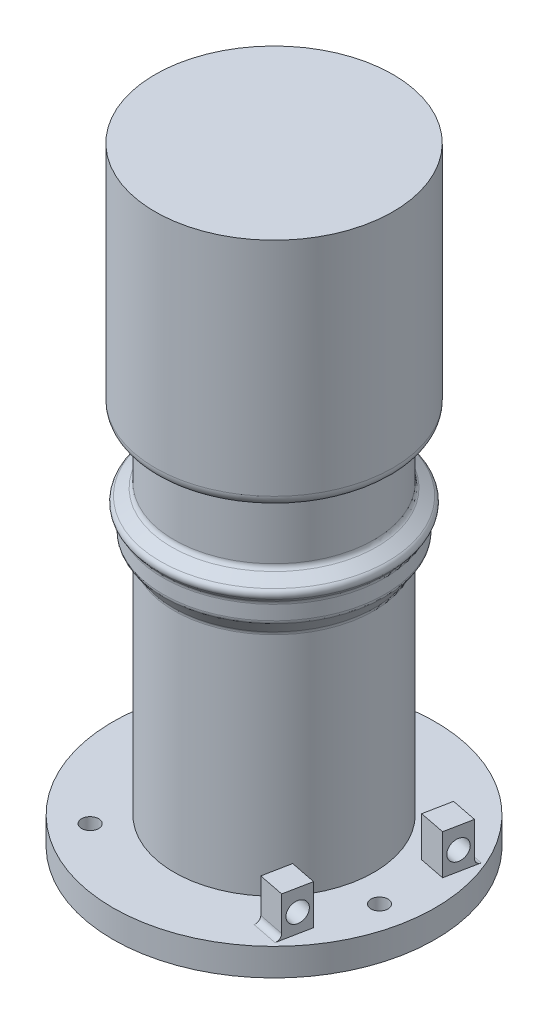
ISO-10303-21;
HEADER;
FILE_DESCRIPTION(('STEP AP214'),'2;1');
FILE_NAME('part.step','',(''),(''),'','','');
FILE_SCHEMA(('AUTOMOTIVE_DESIGN { 1 0 10303 214 1 1 1 1 }'));
ENDSEC;
DATA;
#1=APPLICATION_CONTEXT('core data for automotive mechanical design processes');
#2=APPLICATION_PROTOCOL_DEFINITION('international standard','automotive_design',2000,#1);
#3=PRODUCT_CONTEXT('',#1,'mechanical');
#4=PRODUCT('Part','Part','',(#3));
#5=PRODUCT_RELATED_PRODUCT_CATEGORY('part','',(#4));
#6=PRODUCT_DEFINITION_FORMATION('','',#4);
#7=PRODUCT_DEFINITION_CONTEXT('part definition',#1,'design');
#8=PRODUCT_DEFINITION('design','',#6,#7);
#9=PRODUCT_DEFINITION_SHAPE('','',#8);
#10=(LENGTH_UNIT() NAMED_UNIT(*) SI_UNIT(.MILLI.,.METRE.));
#11=(NAMED_UNIT(*) PLANE_ANGLE_UNIT() SI_UNIT($,.RADIAN.));
#12=(NAMED_UNIT(*) SI_UNIT($,.STERADIAN.) SOLID_ANGLE_UNIT());
#13=UNCERTAINTY_MEASURE_WITH_UNIT(LENGTH_MEASURE(1.E-05),#10,'distance_accuracy_value','');
#14=(GEOMETRIC_REPRESENTATION_CONTEXT(3) GLOBAL_UNCERTAINTY_ASSIGNED_CONTEXT((#13)) GLOBAL_UNIT_ASSIGNED_CONTEXT((#10,
#11,#12)) REPRESENTATION_CONTEXT('',''));
#15=CARTESIAN_POINT('',(0.,0.,0.));
#16=DIRECTION('',(0.,0.,1.));
#17=DIRECTION('',(1.,0.,0.));
#18=AXIS2_PLACEMENT_3D('',#15,#16,#17);
#19=CARTESIAN_POINT('',(0.,0.,0.));
#20=DIRECTION('',(0.,-1.,0.));
#21=DIRECTION('',(0.,0.,-1.));
#22=AXIS2_PLACEMENT_3D('',#19,#20,#21);
#23=PLANE('',#22);
#24=DIRECTION('',(-0.193989978070431,0.,0.981003510905152));
#25=VECTOR('',#24,1.);
#26=CARTESIAN_POINT('',(52.5606892906882,0.,-27.3563771241391));
#27=LINE('',#26,#25);
#28=CARTESIAN_POINT('',(53.0534238349871,0.,-29.8481260418382));
#29=VERTEX_POINT('',#28);
#30=CARTESIAN_POINT('',(50.2164876364986,0.,-15.5017953776802));
#31=VERTEX_POINT('',#30);
#32=EDGE_CURVE('E59',#29,#31,#27,.T.);
#33=ORIENTED_EDGE('',*,*,#32,.F.);
#34=DIRECTION('',(-0.981003510905151,0.,-0.193989978070432));
#35=VECTOR('',#34,1.);
#36=CARTESIAN_POINT('',(64.6544074646223,0.,-27.5540725192041));
#37=LINE('',#36,#35);
#38=CARTESIAN_POINT('',(64.6544074646223,0.,-27.5540725192041));
#39=VERTEX_POINT('',#38);
#40=EDGE_CURVE('E223',#29,#39,#37,.F.);
#41=ORIENTED_EDGE('',*,*,#40,.T.);
#42=DIRECTION('',(0.193989978070431,0.,-0.981003510905151));
#43=VECTOR('',#42,1.);
#44=CARTESIAN_POINT('',(64.1616729203234,0.,-25.062323601505));
#45=LINE('',#44,#43);
#46=CARTESIAN_POINT('',(61.8174712661338,0.,-13.2077418550461));
#47=VERTEX_POINT('',#46);
#48=EDGE_CURVE('E67',#47,#39,#45,.T.);
#49=ORIENTED_EDGE('',*,*,#48,.F.);
#50=DIRECTION('',(0.981003510905151,0.,0.193989978070431));
#51=VECTOR('',#50,1.);
#52=CARTESIAN_POINT('',(50.2164876364986,0.,-15.5017953776802));
#53=LINE('',#52,#51);
#54=EDGE_CURVE('E148',#31,#47,#53,.T.);
#55=ORIENTED_EDGE('',*,*,#54,.F.);
#56=EDGE_LOOP('',(#33,#41,#49,#55));
#57=FACE_BOUND('',#56,.T.);
#58=CARTESIAN_POINT('',(57.8789311065348,0.,10.9245812682706));
#59=DIRECTION('',(0.,-1.,0.));
#60=DIRECTION('',(0.,0.,-1.));
#61=AXIS2_PLACEMENT_3D('',#58,#59,#60);
#62=CIRCLE('',#61,3.81);
#63=CARTESIAN_POINT('',(57.8789311065348,0.,7.11458126827061));
#64=VERTEX_POINT('',#63);
#65=EDGE_CURVE('E181',#64,#64,#62,.F.);
#66=ORIENTED_EDGE('',*,*,#65,.F.);
#67=EDGE_LOOP('',(#66));
#68=FACE_BOUND('',#67,.T.);
#69=CARTESIAN_POINT('',(-18.7753126158593,0.,-54.9823180924778));
#70=DIRECTION('',(0.,-1.,0.));
#71=DIRECTION('',(0.,0.,-1.));
#72=AXIS2_PLACEMENT_3D('',#69,#70,#71);
#73=CIRCLE('',#72,3.81);
#74=CARTESIAN_POINT('',(-18.7753126158593,0.,-58.7923180924778));
#75=VERTEX_POINT('',#74);
#76=EDGE_CURVE('E182',#75,#75,#73,.F.);
#77=ORIENTED_EDGE('',*,*,#76,.F.);
#78=EDGE_LOOP('',(#77));
#79=FACE_BOUND('',#78,.T.);
#80=CARTESIAN_POINT('',(-37.5252398857347,0.,44.3556539593735));
#81=DIRECTION('',(0.,-1.,0.));
#82=DIRECTION('',(0.,0.,-1.));
#83=AXIS2_PLACEMENT_3D('',#80,#81,#82);
#84=CIRCLE('',#83,3.81);
#85=CARTESIAN_POINT('',(-37.5252398857347,0.,40.5456539593735));
#86=VERTEX_POINT('',#85);
#87=EDGE_CURVE('E192',#86,#86,#84,.F.);
#88=ORIENTED_EDGE('',*,*,#87,.F.);
#89=EDGE_LOOP('',(#88));
#90=FACE_BOUND('',#89,.T.);
#91=CARTESIAN_POINT('',(0.,0.,0.));
#92=DIRECTION('',(0.,-1.,0.));
#93=DIRECTION('',(0.,0.,-1.));
#94=AXIS2_PLACEMENT_3D('',#91,#92,#93);
#95=CIRCLE('',#94,44.45);
#96=CARTESIAN_POINT('',(0.,0.,-44.45));
#97=VERTEX_POINT('',#96);
#98=EDGE_CURVE('E207',#97,#97,#95,.T.);
#99=ORIENTED_EDGE('',*,*,#98,.T.);
#100=EDGE_LOOP('',(#99));
#101=FACE_BOUND('',#100,.T.);
#102=CARTESIAN_POINT('',(0.,0.,0.));
#103=DIRECTION('',(0.,-1.,0.));
#104=DIRECTION('',(0.,0.,-1.));
#105=AXIS2_PLACEMENT_3D('',#102,#103,#104);
#106=CIRCLE('',#105,71.755);
#107=CARTESIAN_POINT('',(0.,0.,71.755));
#108=VERTEX_POINT('',#107);
#109=EDGE_CURVE('E195',#108,#108,#106,.T.);
#110=ORIENTED_EDGE('',*,*,#109,.F.);
#111=EDGE_LOOP('',(#110));
#112=FACE_BOUND('',#111,.T.);
#113=DIRECTION('',(0.193989978070432,0.,-0.981003510905151));
#114=VECTOR('',#113,1.);
#115=CARTESIAN_POINT('',(49.9918422029603,0.,46.5942321697319));
#116=LINE('',#115,#114);
#117=CARTESIAN_POINT('',(49.4991076586614,0.,49.085981087431));
#118=VERTEX_POINT('',#117);
#119=CARTESIAN_POINT('',(52.3360438571499,0.,34.739650423273));
#120=VERTEX_POINT('',#119);
#121=EDGE_CURVE('E146',#118,#120,#116,.T.);
#122=ORIENTED_EDGE('',*,*,#121,.F.);
#123=DIRECTION('',(0.981003510905151,0.,0.193989978070432));
#124=VECTOR('',#123,1.);
#125=CARTESIAN_POINT('',(37.8981240290261,0.,46.7919275647969));
#126=LINE('',#125,#124);
#127=CARTESIAN_POINT('',(37.8981240290261,0.,46.7919275647969));
#128=VERTEX_POINT('',#127);
#129=EDGE_CURVE('E213',#118,#128,#126,.F.);
#130=ORIENTED_EDGE('',*,*,#129,.T.);
#131=DIRECTION('',(-0.193989978070432,0.,0.981003510905151));
#132=VECTOR('',#131,1.);
#133=CARTESIAN_POINT('',(38.390858573325,0.,44.3001786470978));
#134=LINE('',#133,#132);
#135=CARTESIAN_POINT('',(40.7350602275147,0.,32.4455969006389));
#136=VERTEX_POINT('',#135);
#137=EDGE_CURVE('E142',#136,#128,#134,.T.);
#138=ORIENTED_EDGE('',*,*,#137,.F.);
#139=DIRECTION('',(-0.981003510905151,0.,-0.193989978070432));
#140=VECTOR('',#139,1.);
#141=CARTESIAN_POINT('',(40.7350602275147,0.,32.4455969006389));
#142=LINE('',#141,#140);
#143=EDGE_CURVE('E368',#120,#136,#142,.T.);
#144=ORIENTED_EDGE('',*,*,#143,.F.);
#145=EDGE_LOOP('',(#122,#130,#138,#144));
#146=FACE_BOUND('',#145,.T.);
#147=ADVANCED_FACE('F44',(#57,#68,#79,#90,#101,#112,#146),#23,.F.);
#148=CARTESIAN_POINT('',(0.,0.,0.));
#149=DIRECTION('',(0.,-1.,0.));
#150=DIRECTION('',(0.,0.,-1.));
#151=AXIS2_PLACEMENT_3D('',#148,#149,#150);
#152=CYLINDRICAL_SURFACE('',#151,44.45);
#153=CARTESIAN_POINT('',(0.,100.818023077266,0.));
#154=DIRECTION('',(0.,-1.,0.));
#155=DIRECTION('',(0.,0.,-1.));
#156=AXIS2_PLACEMENT_3D('',#153,#154,#155);
#157=CIRCLE('',#156,44.45);
#158=CARTESIAN_POINT('',(0.,100.818023077266,-44.45));
#159=VERTEX_POINT('',#158);
#160=EDGE_CURVE('E256',#159,#159,#157,.T.);
#161=ORIENTED_EDGE('',*,*,#160,.T.);
#162=EDGE_LOOP('',(#161));
#163=FACE_BOUND('',#162,.T.);
#164=ORIENTED_EDGE('',*,*,#98,.F.);
#165=EDGE_LOOP('',(#164));
#166=FACE_BOUND('',#165,.T.);
#167=ADVANCED_FACE('F279',(#163,#166),#152,.T.);
#168=CARTESIAN_POINT('',(0.,101.6,0.));
#169=DIRECTION('',(0.,1.,0.));
#170=DIRECTION('',(0.,0.,1.));
#171=AXIS2_PLACEMENT_3D('',#168,#169,#170);
#172=CONICAL_SURFACE('',#171,44.45,0.597313233873245);
#173=CARTESIAN_POINT('',(0.,108.310451168298,0.));
#174=DIRECTION('',(0.,-1.,0.));
#175=DIRECTION('',(0.,0.,-1.));
#176=AXIS2_PLACEMENT_3D('',#173,#174,#175);
#177=CIRCLE('',#176,49.0144471867547);
#178=CARTESIAN_POINT('',(0.,108.310451168298,-49.0144471867547));
#179=VERTEX_POINT('',#178);
#180=EDGE_CURVE('E253',#179,#179,#177,.T.);
#181=ORIENTED_EDGE('',*,*,#180,.T.);
#182=EDGE_LOOP('',(#181));
#183=FACE_BOUND('',#182,.T.);
#184=CARTESIAN_POINT('',(0.,102.246577381176,0.));
#185=DIRECTION('',(0.,1.,0.));
#186=DIRECTION('',(0.,0.,1.));
#187=AXIS2_PLACEMENT_3D('',#184,#185,#186);
#188=CIRCLE('',#187,44.8898017710745);
#189=CARTESIAN_POINT('',(0.,102.246577381176,44.8898017710745));
#190=VERTEX_POINT('',#189);
#191=EDGE_CURVE('E250',#190,#190,#188,.T.);
#192=ORIENTED_EDGE('',*,*,#191,.T.);
#193=EDGE_LOOP('',(#192));
#194=FACE_BOUND('',#193,.T.);
#195=ADVANCED_FACE('F286',(#183,#194),#172,.T.);
#196=CARTESIAN_POINT('',(0.,0.,0.));
#197=DIRECTION('',(0.,-1.,0.));
#198=DIRECTION('',(0.,0.,-1.));
#199=AXIS2_PLACEMENT_3D('',#196,#197,#198);
#200=CYLINDRICAL_SURFACE('',#199,49.4542489578292);
#201=CARTESIAN_POINT('',(0.,116.081540511069,0.));
#202=DIRECTION('',(0.,-1.,0.));
#203=DIRECTION('',(0.,0.,-1.));
#204=AXIS2_PLACEMENT_3D('',#201,#202,#203);
#205=CIRCLE('',#204,49.4542489578292);
#206=CARTESIAN_POINT('',(0.,116.081540511069,-49.4542489578292));
#207=VERTEX_POINT('',#206);
#208=EDGE_CURVE('E247',#207,#207,#205,.T.);
#209=ORIENTED_EDGE('',*,*,#208,.T.);
#210=EDGE_LOOP('',(#209));
#211=FACE_BOUND('',#210,.T.);
#212=CARTESIAN_POINT('',(0.,109.739005472208,0.));
#213=DIRECTION('',(0.,1.,0.));
#214=DIRECTION('',(0.,0.,1.));
#215=AXIS2_PLACEMENT_3D('',#212,#213,#214);
#216=CIRCLE('',#215,49.4542489578292);
#217=CARTESIAN_POINT('',(0.,109.739005472208,49.4542489578292));
#218=VERTEX_POINT('',#217);
#219=EDGE_CURVE('E244',#218,#218,#216,.T.);
#220=ORIENTED_EDGE('',*,*,#219,.T.);
#221=EDGE_LOOP('',(#220));
#222=FACE_BOUND('',#221,.T.);
#223=ADVANCED_FACE('F319',(#211,#222),#200,.T.);
#224=CARTESIAN_POINT('',(0.,116.953034196429,0.));
#225=DIRECTION('',(0.,1.,0.));
#226=DIRECTION('',(0.,0.,1.));
#227=AXIS2_PLACEMENT_3D('',#224,#225,#226);
#228=CONICAL_SURFACE('',#227,49.4542489578292,0.661043168850689);
#229=CARTESIAN_POINT('',(0.,119.23228061284,0.));
#230=DIRECTION('',(0.,-1.,0.));
#231=DIRECTION('',(0.,0.,-1.));
#232=AXIS2_PLACEMENT_3D('',#229,#230,#231);
#233=CIRCLE('',#232,51.226996170593);
#234=CARTESIAN_POINT('',(0.,119.23228061284,-51.226996170593));
#235=VERTEX_POINT('',#234);
#236=EDGE_CURVE('E241',#235,#235,#233,.T.);
#237=ORIENTED_EDGE('',*,*,#236,.T.);
#238=EDGE_LOOP('',(#237));
#239=FACE_BOUND('',#238,.T.);
#240=CARTESIAN_POINT('',(0.,117.640949669397,0.));
#241=DIRECTION('',(0.,1.,0.));
#242=DIRECTION('',(0.,0.,1.));
#243=AXIS2_PLACEMENT_3D('',#240,#241,#242);
#244=CIRCLE('',#243,49.9892943256934);
#245=CARTESIAN_POINT('',(0.,117.640949669397,49.9892943256934));
#246=VERTEX_POINT('',#245);
#247=EDGE_CURVE('E238',#246,#246,#244,.T.);
#248=ORIENTED_EDGE('',*,*,#247,.T.);
#249=EDGE_LOOP('',(#248));
#250=FACE_BOUND('',#249,.T.);
#251=ADVANCED_FACE('F315',(#239,#250),#228,.T.);
#252=CARTESIAN_POINT('',(0.,121.450787372842,0.));
#253=DIRECTION('',(0.,-1.,0.));
#254=DIRECTION('',(0.,0.,-1.));
#255=AXIS2_PLACEMENT_3D('',#252,#253,#254);
#256=CONICAL_SURFACE('',#255,52.9525014283722,1.01079369993552);
#257=CARTESIAN_POINT('',(0.,126.034893598888,0.));
#258=DIRECTION('',(0.,-1.,0.));
#259=DIRECTION('',(0.,0.,-1.));
#260=AXIS2_PLACEMENT_3D('',#257,#258,#259);
#261=CIRCLE('',#260,45.6407814042107);
#262=CARTESIAN_POINT('',(0.,126.034893598888,-45.6407814042107));
#263=VERTEX_POINT('',#262);
#264=EDGE_CURVE('E232',#263,#263,#261,.T.);
#265=ORIENTED_EDGE('',*,*,#264,.T.);
#266=EDGE_LOOP('',(#265));
#267=FACE_BOUND('',#266,.T.);
#268=CARTESIAN_POINT('',(0.,122.943714208942,0.));
#269=DIRECTION('',(0.,1.,0.));
#270=DIRECTION('',(0.,0.,1.));
#271=AXIS2_PLACEMENT_3D('',#268,#269,#270);
#272=CIRCLE('',#271,50.5712601342464);
#273=CARTESIAN_POINT('',(0.,122.943714208942,50.5712601342464));
#274=VERTEX_POINT('',#273);
#275=EDGE_CURVE('E229',#274,#274,#272,.T.);
#276=ORIENTED_EDGE('',*,*,#275,.T.);
#277=EDGE_LOOP('',(#276));
#278=FACE_BOUND('',#277,.T.);
#279=ADVANCED_FACE('F311',(#267,#278),#256,.T.);
#280=CARTESIAN_POINT('',(0.,0.,0.));
#281=DIRECTION('',(0.,-1.,0.));
#282=DIRECTION('',(0.,0.,-1.));
#283=AXIS2_PLACEMENT_3D('',#280,#281,#282);
#284=CYLINDRICAL_SURFACE('',#283,44.45);
#285=CARTESIAN_POINT('',(0.,128.186918036662,0.));
#286=DIRECTION('',(0.,-1.,0.));
#287=DIRECTION('',(0.,0.,-1.));
#288=AXIS2_PLACEMENT_3D('',#285,#286,#287);
#289=CIRCLE('',#288,44.45);
#290=CARTESIAN_POINT('',(0.,128.186918036662,-44.45));
#291=VERTEX_POINT('',#290);
#292=EDGE_CURVE('E235',#291,#291,#289,.F.);
#293=ORIENTED_EDGE('',*,*,#292,.T.);
#294=EDGE_LOOP('',(#293));
#295=FACE_BOUND('',#294,.T.);
#296=CARTESIAN_POINT('',(0.,152.181457804145,0.));
#297=DIRECTION('',(0.,-1.,0.));
#298=DIRECTION('',(0.,0.,-1.));
#299=AXIS2_PLACEMENT_3D('',#296,#297,#298);
#300=CIRCLE('',#299,44.45);
#301=CARTESIAN_POINT('',(0.,152.181457804145,-44.45));
#302=VERTEX_POINT('',#301);
#303=EDGE_CURVE('E204',#302,#302,#300,.T.);
#304=ORIENTED_EDGE('',*,*,#303,.T.);
#305=EDGE_LOOP('',(#304));
#306=FACE_BOUND('',#305,.T.);
#307=ADVANCED_FACE('F308',(#295,#306),#284,.T.);
#308=CARTESIAN_POINT('',(0.,152.181457804145,0.));
#309=DIRECTION('',(0.,1.,0.));
#310=DIRECTION('',(0.,0.,1.));
#311=AXIS2_PLACEMENT_3D('',#308,#309,#310);
#312=CONICAL_SURFACE('',#311,44.45,1.02498196691277);
#313=CARTESIAN_POINT('',(0.,155.861823215251,0.));
#314=DIRECTION('',(0.,-1.,0.));
#315=DIRECTION('',(0.,0.,-1.));
#316=AXIS2_PLACEMENT_3D('',#313,#314,#315);
#317=CIRCLE('',#316,50.5096020717855);
#318=CARTESIAN_POINT('',(0.,155.861823215251,-50.5096020717855));
#319=VERTEX_POINT('',#318);
#320=EDGE_CURVE('E52',#319,#319,#317,.T.);
#321=ORIENTED_EDGE('',*,*,#320,.T.);
#322=EDGE_LOOP('',(#321));
#323=FACE_BOUND('',#322,.T.);
#324=ORIENTED_EDGE('',*,*,#303,.F.);
#325=EDGE_LOOP('',(#324));
#326=FACE_BOUND('',#325,.T.);
#327=ADVANCED_FACE('F261',(#323,#326),#312,.T.);
#328=CARTESIAN_POINT('',(0.,0.,0.));
#329=DIRECTION('',(0.,-1.,0.));
#330=DIRECTION('',(0.,0.,-1.));
#331=AXIS2_PLACEMENT_3D('',#328,#329,#330);
#332=CYLINDRICAL_SURFACE('',#331,52.9525014283722);
#333=CARTESIAN_POINT('',(0.,160.20372374342,0.));
#334=DIRECTION('',(0.,1.,0.));
#335=DIRECTION('',(0.,0.,1.));
#336=AXIS2_PLACEMENT_3D('',#333,#334,#335);
#337=CIRCLE('',#336,52.9525014283722);
#338=CARTESIAN_POINT('',(0.,160.20372374342,52.9525014283722));
#339=VERTEX_POINT('',#338);
#340=EDGE_CURVE('E13',#339,#339,#337,.T.);
#341=ORIENTED_EDGE('',*,*,#340,.T.);
#342=EDGE_LOOP('',(#341));
#343=FACE_BOUND('',#342,.T.);
#344=CARTESIAN_POINT('',(0.,258.945544784471,0.));
#345=DIRECTION('',(0.,-1.,0.));
#346=DIRECTION('',(0.,0.,-1.));
#347=AXIS2_PLACEMENT_3D('',#344,#345,#346);
#348=CIRCLE('',#347,52.9525014283722);
#349=CARTESIAN_POINT('',(0.,258.945544784471,-52.9525014283722));
#350=VERTEX_POINT('',#349);
#351=EDGE_CURVE('E199',#350,#350,#348,.T.);
#352=ORIENTED_EDGE('',*,*,#351,.T.);
#353=EDGE_LOOP('',(#352));
#354=FACE_BOUND('',#353,.T.);
#355=ADVANCED_FACE('F301',(#343,#354),#332,.T.);
#356=CARTESIAN_POINT('',(52.9525014283722,258.945544784471,0.));
#357=DIRECTION('',(0.,1.,0.));
#358=DIRECTION('',(0.,0.,1.));
#359=AXIS2_PLACEMENT_3D('',#356,#357,#358);
#360=PLANE('',#359);
#361=ORIENTED_EDGE('',*,*,#351,.F.);
#362=EDGE_LOOP('',(#361));
#363=FACE_BOUND('',#362,.T.);
#364=ADVANCED_FACE('F297',(#363),#360,.T.);
#365=CARTESIAN_POINT('',(0.,-12.192,0.));
#366=DIRECTION('',(0.,1.,0.));
#367=DIRECTION('',(0.,0.,1.));
#368=AXIS2_PLACEMENT_3D('',#365,#366,#367);
#369=CYLINDRICAL_SURFACE('',#368,71.755);
#370=CARTESIAN_POINT('',(0.,-12.192,0.));
#371=DIRECTION('',(0.,-1.,0.));
#372=DIRECTION('',(0.,0.,-1.));
#373=AXIS2_PLACEMENT_3D('',#370,#371,#372);
#374=CIRCLE('',#373,71.755);
#375=CARTESIAN_POINT('',(0.,-12.192,71.755));
#376=VERTEX_POINT('',#375);
#377=EDGE_CURVE('E196',#376,#376,#374,.T.);
#378=CARTESIAN_POINT('',(0.,-12.192,71.755));
#379=CARTESIAN_POINT('',(0.,-12.065,71.755));
#380=CARTESIAN_POINT('',(0.,-11.938,71.755));
#381=CARTESIAN_POINT('',(0.,-11.684,71.755));
#382=CARTESIAN_POINT('',(0.,-11.557,71.755));
#383=CARTESIAN_POINT('',(0.,-11.303,71.755));
#384=CARTESIAN_POINT('',(0.,-11.176,71.755));
#385=CARTESIAN_POINT('',(0.,-10.922,71.755));
#386=CARTESIAN_POINT('',(0.,-10.795,71.755));
#387=CARTESIAN_POINT('',(0.,-10.541,71.755));
#388=CARTESIAN_POINT('',(0.,-10.414,71.755));
#389=CARTESIAN_POINT('',(0.,-10.16,71.755));
#390=CARTESIAN_POINT('',(0.,-10.033,71.755));
#391=CARTESIAN_POINT('',(0.,-9.779,71.755));
#392=CARTESIAN_POINT('',(0.,-9.652,71.755));
#393=CARTESIAN_POINT('',(0.,-9.398,71.755));
#394=CARTESIAN_POINT('',(0.,-9.271,71.755));
#395=CARTESIAN_POINT('',(0.,-9.017,71.755));
#396=CARTESIAN_POINT('',(0.,-8.89,71.755));
#397=CARTESIAN_POINT('',(0.,-8.636,71.755));
#398=CARTESIAN_POINT('',(0.,-8.509,71.755));
#399=CARTESIAN_POINT('',(0.,-8.255,71.755));
#400=CARTESIAN_POINT('',(0.,-8.128,71.755));
#401=CARTESIAN_POINT('',(0.,-7.874,71.755));
#402=CARTESIAN_POINT('',(0.,-7.747,71.755));
#403=CARTESIAN_POINT('',(0.,-7.493,71.755));
#404=CARTESIAN_POINT('',(0.,-7.366,71.755));
#405=CARTESIAN_POINT('',(0.,-7.112,71.755));
#406=CARTESIAN_POINT('',(0.,-6.985,71.755));
#407=CARTESIAN_POINT('',(0.,-6.731,71.755));
#408=CARTESIAN_POINT('',(0.,-6.604,71.755));
#409=CARTESIAN_POINT('',(0.,-6.35,71.755));
#410=CARTESIAN_POINT('',(0.,-6.223,71.755));
#411=CARTESIAN_POINT('',(0.,-5.969,71.755));
#412=CARTESIAN_POINT('',(0.,-5.842,71.755));
#413=CARTESIAN_POINT('',(0.,-5.588,71.755));
#414=CARTESIAN_POINT('',(0.,-5.461,71.755));
#415=CARTESIAN_POINT('',(0.,-5.207,71.755));
#416=CARTESIAN_POINT('',(0.,-5.08,71.755));
#417=CARTESIAN_POINT('',(0.,-4.826,71.755));
#418=CARTESIAN_POINT('',(0.,-4.699,71.755));
#419=CARTESIAN_POINT('',(0.,-4.445,71.755));
#420=CARTESIAN_POINT('',(0.,-4.318,71.755));
#421=CARTESIAN_POINT('',(0.,-4.064,71.755));
#422=CARTESIAN_POINT('',(0.,-3.937,71.755));
#423=CARTESIAN_POINT('',(0.,-3.683,71.755));
#424=CARTESIAN_POINT('',(0.,-3.556,71.755));
#425=CARTESIAN_POINT('',(0.,-3.302,71.755));
#426=CARTESIAN_POINT('',(0.,-3.175,71.755));
#427=CARTESIAN_POINT('',(0.,-2.921,71.755));
#428=CARTESIAN_POINT('',(0.,-2.794,71.755));
#429=CARTESIAN_POINT('',(0.,-2.54,71.755));
#430=CARTESIAN_POINT('',(0.,-2.413,71.755));
#431=CARTESIAN_POINT('',(0.,-2.159,71.755));
#432=CARTESIAN_POINT('',(0.,-2.032,71.755));
#433=CARTESIAN_POINT('',(0.,-1.778,71.755));
#434=CARTESIAN_POINT('',(0.,-1.651,71.755));
#435=CARTESIAN_POINT('',(0.,-1.397,71.755));
#436=CARTESIAN_POINT('',(0.,-1.27,71.755));
#437=CARTESIAN_POINT('',(0.,-1.016,71.755));
#438=CARTESIAN_POINT('',(0.,-0.889,71.755));
#439=CARTESIAN_POINT('',(0.,-0.635,71.755));
#440=CARTESIAN_POINT('',(0.,-0.508,71.755));
#441=CARTESIAN_POINT('',(0.,-0.254,71.755));
#442=CARTESIAN_POINT('',(0.,-0.127,71.755));
#443=CARTESIAN_POINT('',(0.,0.,71.755));
#444=B_SPLINE_CURVE_WITH_KNOTS('',3,(#378,#379,#380,#381,#382,#383,#384,#385,#386,#387,#388,
#389,#390,#391,#392,#393,#394,#395,#396,#397,#398,#399,#400,#401,#402,#403,#404,#405,#406,#407,
#408,#409,#410,#411,#412,#413,#414,#415,#416,#417,#418,#419,#420,#421,#422,#423,#424,#425,#426,
#427,#428,#429,#430,#431,#432,#433,#434,#435,#436,#437,#438,#439,#440,#441,#442,#443),
.UNSPECIFIED.,.F.,.F.,(4,2,2,2,2,2,2,2,2,2,2,2,2,2,2,2,2,2,2,2,2,2,2,2,2,2,2,2,2,2,2,2,4),(0.,
0.380999999999999,0.761999999999999,1.143,1.524,1.905,2.286,2.667,3.048,3.429,3.81,4.191,4.572,
4.953,5.334,5.715,6.096,6.477,6.858,7.239,7.62,8.001,8.382,8.763,9.144,9.525,9.906,10.287,
10.668,11.049,11.43,11.811,12.192),.UNSPECIFIED.);
#445=EDGE_CURVE('BSEAM294',#376,#108,#444,.T.);
#446=ORIENTED_EDGE('',*,*,#377,.F.);
#447=ORIENTED_EDGE('',*,*,#109,.T.);
#448=ORIENTED_EDGE('',*,*,#445,.T.);
#449=ORIENTED_EDGE('',*,*,#445,.F.);
#450=EDGE_LOOP('',(#446,#448,#447,#449));
#451=FACE_BOUND('',#450,.T.);
#452=ADVANCED_FACE('F294',(#451),#369,.T.);
#453=CARTESIAN_POINT('',(0.,-12.192,0.));
#454=DIRECTION('',(0.,-1.,0.));
#455=DIRECTION('',(0.,0.,-1.));
#456=AXIS2_PLACEMENT_3D('',#453,#454,#455);
#457=PLANE('',#456);
#458=CARTESIAN_POINT('',(0.,-12.192,0.));
#459=DIRECTION('',(0.,-1.,0.));
#460=DIRECTION('',(0.,0.,-1.));
#461=AXIS2_PLACEMENT_3D('',#458,#459,#460);
#462=CIRCLE('',#461,37.8612382029253);
#463=CARTESIAN_POINT('',(0.,-12.192,-37.8612382029253));
#464=VERTEX_POINT('',#463);
#465=EDGE_CURVE('E397',#464,#464,#462,.T.);
#466=ORIENTED_EDGE('',*,*,#465,.F.);
#467=EDGE_LOOP('',(#466));
#468=FACE_BOUND('',#467,.T.);
#469=CARTESIAN_POINT('',(57.8789311065348,-12.192,10.9245812682706));
#470=DIRECTION('',(0.,-1.,0.));
#471=DIRECTION('',(0.,0.,-1.));
#472=AXIS2_PLACEMENT_3D('',#469,#470,#471);
#473=CIRCLE('',#472,3.81);
#474=CARTESIAN_POINT('',(57.8789311065348,-12.192,7.11458126827061));
#475=VERTEX_POINT('',#474);
#476=EDGE_CURVE('E178',#475,#475,#473,.T.);
#477=ORIENTED_EDGE('',*,*,#476,.F.);
#478=EDGE_LOOP('',(#477));
#479=FACE_BOUND('',#478,.T.);
#480=CARTESIAN_POINT('',(-18.7753126158593,-12.192,-54.9823180924778));
#481=DIRECTION('',(0.,-1.,0.));
#482=DIRECTION('',(0.,0.,-1.));
#483=AXIS2_PLACEMENT_3D('',#480,#481,#482);
#484=CIRCLE('',#483,3.81);
#485=CARTESIAN_POINT('',(-18.7753126158593,-12.192,-58.7923180924778));
#486=VERTEX_POINT('',#485);
#487=EDGE_CURVE('E177',#486,#486,#484,.T.);
#488=ORIENTED_EDGE('',*,*,#487,.F.);
#489=EDGE_LOOP('',(#488));
#490=FACE_BOUND('',#489,.T.);
#491=CARTESIAN_POINT('',(-37.5252398857347,-12.192,44.3556539593735));
#492=DIRECTION('',(0.,-1.,0.));
#493=DIRECTION('',(0.,0.,-1.));
#494=AXIS2_PLACEMENT_3D('',#491,#492,#493);
#495=CIRCLE('',#494,3.81);
#496=CARTESIAN_POINT('',(-37.5252398857347,-12.192,40.5456539593735));
#497=VERTEX_POINT('',#496);
#498=EDGE_CURVE('E185',#497,#497,#495,.T.);
#499=ORIENTED_EDGE('',*,*,#498,.F.);
#500=EDGE_LOOP('',(#499));
#501=FACE_BOUND('',#500,.T.);
#502=ORIENTED_EDGE('',*,*,#377,.T.);
#503=EDGE_LOOP('',(#502));
#504=FACE_BOUND('',#503,.T.);
#505=ADVANCED_FACE('F292',(#468,#479,#490,#501,#504),#457,.T.);
#506=CARTESIAN_POINT('',(-37.5252398857347,10.776307345283,44.3556539593735));
#507=DIRECTION('',(0.,-1.,0.));
#508=DIRECTION('',(0.,0.,-1.));
#509=AXIS2_PLACEMENT_3D('',#506,#507,#508);
#510=CYLINDRICAL_SURFACE('',#509,3.81);
#511=ORIENTED_EDGE('',*,*,#87,.T.);
#512=EDGE_LOOP('',(#511));
#513=FACE_BOUND('',#512,.T.);
#514=ORIENTED_EDGE('',*,*,#498,.T.);
#515=EDGE_LOOP('',(#514));
#516=FACE_BOUND('',#515,.T.);
#517=ADVANCED_FACE('F408',(#513,#516),#510,.F.);
#518=CARTESIAN_POINT('',(-18.7753126158593,10.776307345283,-54.9823180924778));
#519=DIRECTION('',(0.,-1.,0.));
#520=DIRECTION('',(0.,0.,-1.));
#521=AXIS2_PLACEMENT_3D('',#518,#519,#520);
#522=CYLINDRICAL_SURFACE('',#521,3.81);
#523=ORIENTED_EDGE('',*,*,#76,.T.);
#524=EDGE_LOOP('',(#523));
#525=FACE_BOUND('',#524,.T.);
#526=ORIENTED_EDGE('',*,*,#487,.T.);
#527=EDGE_LOOP('',(#526));
#528=FACE_BOUND('',#527,.T.);
#529=ADVANCED_FACE('F419',(#525,#528),#522,.F.);
#530=CARTESIAN_POINT('',(57.8789311065348,10.776307345283,10.9245812682706));
#531=DIRECTION('',(0.,-1.,0.));
#532=DIRECTION('',(0.,0.,-1.));
#533=AXIS2_PLACEMENT_3D('',#530,#531,#532);
#534=CYLINDRICAL_SURFACE('',#533,3.81);
#535=ORIENTED_EDGE('',*,*,#65,.T.);
#536=EDGE_LOOP('',(#535));
#537=FACE_BOUND('',#536,.T.);
#538=ORIENTED_EDGE('',*,*,#476,.T.);
#539=EDGE_LOOP('',(#538));
#540=FACE_BOUND('',#539,.T.);
#541=ADVANCED_FACE('F425',(#537,#540),#534,.F.);
#542=CARTESIAN_POINT('',(52.5606892906882,17.78,-27.3563771241391));
#543=DIRECTION('',(0.981003510905152,0.,0.193989978070431));
#544=DIRECTION('',(0.193989978070431,0.,-0.981003510905152));
#545=AXIS2_PLACEMENT_3D('',#542,#543,#544);
#546=PLANE('',#545);
#547=CARTESIAN_POINT('',(51.3885884635934,8.382,-21.4290862509097));
#548=DIRECTION('',(0.981003510905151,0.,0.193989978070432));
#549=DIRECTION('',(0.193989978070433,0.,-0.981003510905151));
#550=AXIS2_PLACEMENT_3D('',#547,#548,#549);
#551=CIRCLE('',#550,4.445);
#552=CARTESIAN_POINT('',(52.2508739161165,8.382,-25.789646856883));
#553=VERTEX_POINT('',#552);
#554=EDGE_CURVE('E390',#553,#553,#551,.T.);
#555=ORIENTED_EDGE('',*,*,#554,.T.);
#556=EDGE_LOOP('',(#555));
#557=FACE_BOUND('',#556,.T.);
#558=ORIENTED_EDGE('',*,*,#32,.T.);
#559=DIRECTION('',(0.,-1.,0.));
#560=VECTOR('',#559,1.);
#561=CARTESIAN_POINT('',(50.2164876364986,17.78,-15.5017953776802));
#562=LINE('',#561,#560);
#563=CARTESIAN_POINT('',(50.2164876364986,17.78,-15.5017953776802));
#564=VERTEX_POINT('',#563);
#565=EDGE_CURVE('E174',#564,#31,#562,.T.);
#566=ORIENTED_EDGE('',*,*,#565,.F.);
#567=DIRECTION('',(-0.193989978070431,0.,0.981003510905152));
#568=VECTOR('',#567,1.);
#569=CARTESIAN_POINT('',(52.5606892906882,17.78,-27.3563771241391));
#570=LINE('',#569,#568);
#571=CARTESIAN_POINT('',(52.5606892906882,17.78,-27.3563771241391));
#572=VERTEX_POINT('',#571);
#573=EDGE_CURVE('E154',#572,#564,#570,.T.);
#574=ORIENTED_EDGE('',*,*,#573,.F.);
#575=DIRECTION('',(0.,-1.,0.));
#576=VECTOR('',#575,1.);
#577=CARTESIAN_POINT('',(52.5606892906882,17.78,-27.3563771241391));
#578=LINE('',#577,#576);
#579=CARTESIAN_POINT('',(52.5606892906882,2.54,-27.3563771241391));
#580=VERTEX_POINT('',#579);
#581=EDGE_CURVE('E162',#572,#580,#578,.T.);
#582=ORIENTED_EDGE('',*,*,#581,.T.);
#583=CARTESIAN_POINT('',(53.0534238349871,2.54,-29.8481260418382));
#584=DIRECTION('',(0.981003510905152,0.,0.193989978070431));
#585=DIRECTION('',(0.193989978070431,0.,-0.981003510905152));
#586=AXIS2_PLACEMENT_3D('',#583,#584,#585);
#587=CIRCLE('',#586,2.54);
#588=EDGE_CURVE('E225',#580,#29,#587,.T.);
#589=ORIENTED_EDGE('',*,*,#588,.T.);
#590=EDGE_LOOP('',(#558,#566,#574,#582,#589));
#591=FACE_BOUND('',#590,.T.);
#592=ADVANCED_FACE('F431',(#557,#591),#546,.F.);
#593=CARTESIAN_POINT('',(50.2164876364986,17.78,-15.5017953776802));
#594=DIRECTION('',(0.193989978070431,0.,-0.981003510905151));
#595=DIRECTION('',(-0.981003510905151,0.,-0.193989978070431));
#596=AXIS2_PLACEMENT_3D('',#593,#594,#595);
#597=PLANE('',#596);
#598=ORIENTED_EDGE('',*,*,#54,.T.);
#599=DIRECTION('',(0.,-1.,0.));
#600=VECTOR('',#599,1.);
#601=CARTESIAN_POINT('',(61.8174712661338,17.78,-13.2077418550461));
#602=LINE('',#601,#600);
#603=CARTESIAN_POINT('',(61.8174712661338,17.78,-13.2077418550461));
#604=VERTEX_POINT('',#603);
#605=EDGE_CURVE('E172',#604,#47,#602,.T.);
#606=ORIENTED_EDGE('',*,*,#605,.F.);
#607=DIRECTION('',(0.981003510905151,0.,0.193989978070431));
#608=VECTOR('',#607,1.);
#609=CARTESIAN_POINT('',(50.2164876364986,17.78,-15.5017953776802));
#610=LINE('',#609,#608);
#611=EDGE_CURVE('E157',#564,#604,#610,.T.);
#612=ORIENTED_EDGE('',*,*,#611,.F.);
#613=ORIENTED_EDGE('',*,*,#565,.T.);
#614=EDGE_LOOP('',(#598,#606,#612,#613));
#615=FACE_BOUND('',#614,.T.);
#616=ADVANCED_FACE('F435',(#615),#597,.F.);
#617=CARTESIAN_POINT('',(64.1616729203234,17.78,-25.062323601505));
#618=DIRECTION('',(-0.981003510905151,0.,-0.193989978070431));
#619=DIRECTION('',(-0.193989978070432,0.,0.981003510905151));
#620=AXIS2_PLACEMENT_3D('',#617,#618,#619);
#621=PLANE('',#620);
#622=CARTESIAN_POINT('',(62.9895720932286,8.382,-19.1350327282756));
#623=DIRECTION('',(-0.981003510905152,0.,-0.193989978070432));
#624=DIRECTION('',(-0.193989978070432,0.,0.981003510905152));
#625=AXIS2_PLACEMENT_3D('',#622,#623,#624);
#626=CIRCLE('',#625,4.445);
#627=CARTESIAN_POINT('',(62.1272866407056,8.382,-14.7744721223022));
#628=VERTEX_POINT('',#627);
#629=EDGE_CURVE('E393',#628,#628,#626,.T.);
#630=ORIENTED_EDGE('',*,*,#629,.T.);
#631=EDGE_LOOP('',(#630));
#632=FACE_BOUND('',#631,.T.);
#633=ORIENTED_EDGE('',*,*,#48,.T.);
#634=CARTESIAN_POINT('',(64.6544074646223,2.54,-27.5540725192041));
#635=DIRECTION('',(-0.981003510905151,0.,-0.193989978070431));
#636=DIRECTION('',(-0.193989978070432,0.,0.981003510905151));
#637=AXIS2_PLACEMENT_3D('',#634,#635,#636);
#638=CIRCLE('',#637,2.54);
#639=CARTESIAN_POINT('',(64.1616729203234,2.54,-25.062323601505));
#640=VERTEX_POINT('',#639);
#641=EDGE_CURVE('E227',#39,#640,#638,.T.);
#642=ORIENTED_EDGE('',*,*,#641,.T.);
#643=DIRECTION('',(0.,-1.,0.));
#644=VECTOR('',#643,1.);
#645=CARTESIAN_POINT('',(64.1616729203234,17.78,-25.062323601505));
#646=LINE('',#645,#644);
#647=CARTESIAN_POINT('',(64.1616729203234,17.78,-25.062323601505));
#648=VERTEX_POINT('',#647);
#649=EDGE_CURVE('E169',#648,#640,#646,.T.);
#650=ORIENTED_EDGE('',*,*,#649,.F.);
#651=DIRECTION('',(0.193989978070431,0.,-0.981003510905151));
#652=VECTOR('',#651,1.);
#653=CARTESIAN_POINT('',(64.1616729203234,17.78,-25.062323601505));
#654=LINE('',#653,#652);
#655=EDGE_CURVE('E159',#604,#648,#654,.T.);
#656=ORIENTED_EDGE('',*,*,#655,.F.);
#657=ORIENTED_EDGE('',*,*,#605,.T.);
#658=EDGE_LOOP('',(#633,#642,#650,#656,#657));
#659=FACE_BOUND('',#658,.T.);
#660=ADVANCED_FACE('F439',(#632,#659),#621,.F.);
#661=CARTESIAN_POINT('',(52.5606892906882,17.78,-27.3563771241391));
#662=DIRECTION('',(-0.193989978070432,0.,0.981003510905151));
#663=DIRECTION('',(0.981003510905151,0.,0.193989978070432));
#664=AXIS2_PLACEMENT_3D('',#661,#662,#663);
#665=PLANE('',#664);
#666=ORIENTED_EDGE('',*,*,#649,.T.);
#667=DIRECTION('',(-0.981003510905151,0.,-0.193989978070432));
#668=VECTOR('',#667,1.);
#669=CARTESIAN_POINT('',(52.5606892906882,2.54,-27.3563771241391));
#670=LINE('',#669,#668);
#671=EDGE_CURVE('E220',#640,#580,#670,.T.);
#672=ORIENTED_EDGE('',*,*,#671,.T.);
#673=ORIENTED_EDGE('',*,*,#581,.F.);
#674=DIRECTION('',(-0.981003510905151,0.,-0.193989978070432));
#675=VECTOR('',#674,1.);
#676=CARTESIAN_POINT('',(52.5606892906882,17.78,-27.3563771241391));
#677=LINE('',#676,#675);
#678=EDGE_CURVE('E161',#648,#572,#677,.T.);
#679=ORIENTED_EDGE('',*,*,#678,.F.);
#680=EDGE_LOOP('',(#666,#672,#673,#679));
#681=FACE_BOUND('',#680,.T.);
#682=ADVANCED_FACE('F443',(#681),#665,.F.);
#683=CARTESIAN_POINT('',(0.,17.78,0.));
#684=DIRECTION('',(0.,1.,0.));
#685=DIRECTION('',(0.,0.,1.));
#686=AXIS2_PLACEMENT_3D('',#683,#684,#685);
#687=PLANE('',#686);
#688=ORIENTED_EDGE('',*,*,#573,.T.);
#689=ORIENTED_EDGE('',*,*,#611,.T.);
#690=ORIENTED_EDGE('',*,*,#655,.T.);
#691=ORIENTED_EDGE('',*,*,#678,.T.);
#692=EDGE_LOOP('',(#688,#689,#690,#691));
#693=FACE_BOUND('',#692,.T.);
#694=ADVANCED_FACE('F447',(#693),#687,.T.);
#695=CARTESIAN_POINT('',(49.9918422029603,17.78,46.5942321697319));
#696=DIRECTION('',(-0.981003510905151,0.,-0.193989978070432));
#697=DIRECTION('',(-0.193989978070432,0.,0.981003510905151));
#698=AXIS2_PLACEMENT_3D('',#695,#696,#697);
#699=PLANE('',#698);
#700=CARTESIAN_POINT('',(51.1639430300551,8.382,40.6669412965025));
#701=DIRECTION('',(0.981003510905151,0.,0.193989978070432));
#702=DIRECTION('',(0.193989978070432,0.,-0.981003510905151));
#703=AXIS2_PLACEMENT_3D('',#700,#701,#702);
#704=CIRCLE('',#703,4.445);
#705=CARTESIAN_POINT('',(52.0262284825782,8.382,36.3063806905291));
#706=VERTEX_POINT('',#705);
#707=EDGE_CURVE('E387',#706,#706,#704,.T.);
#708=ORIENTED_EDGE('',*,*,#707,.F.);
#709=EDGE_LOOP('',(#708));
#710=FACE_BOUND('',#709,.T.);
#711=ORIENTED_EDGE('',*,*,#121,.T.);
#712=DIRECTION('',(0.,-1.,0.));
#713=VECTOR('',#712,1.);
#714=CARTESIAN_POINT('',(52.3360438571499,17.78,34.739650423273));
#715=LINE('',#714,#713);
#716=CARTESIAN_POINT('',(52.3360438571499,17.78,34.739650423273));
#717=VERTEX_POINT('',#716);
#718=EDGE_CURVE('E126',#717,#120,#715,.T.);
#719=ORIENTED_EDGE('',*,*,#718,.F.);
#720=DIRECTION('',(0.193989978070432,0.,-0.981003510905151));
#721=VECTOR('',#720,1.);
#722=CARTESIAN_POINT('',(49.9918422029603,17.78,46.5942321697319));
#723=LINE('',#722,#721);
#724=CARTESIAN_POINT('',(49.9918422029603,17.78,46.5942321697319));
#725=VERTEX_POINT('',#724);
#726=EDGE_CURVE('E133',#725,#717,#723,.T.);
#727=ORIENTED_EDGE('',*,*,#726,.F.);
#728=DIRECTION('',(0.,-1.,0.));
#729=VECTOR('',#728,1.);
#730=CARTESIAN_POINT('',(49.9918422029603,17.78,46.5942321697319));
#731=LINE('',#730,#729);
#732=CARTESIAN_POINT('',(49.9918422029603,2.54,46.5942321697319));
#733=VERTEX_POINT('',#732);
#734=EDGE_CURVE('E371',#725,#733,#731,.T.);
#735=ORIENTED_EDGE('',*,*,#734,.T.);
#736=CARTESIAN_POINT('',(49.4991076586614,2.54,49.085981087431));
#737=DIRECTION('',(-0.981003510905151,0.,-0.193989978070432));
#738=DIRECTION('',(-0.193989978070432,0.,0.981003510905151));
#739=AXIS2_PLACEMENT_3D('',#736,#737,#738);
#740=CIRCLE('',#739,2.54);
#741=EDGE_CURVE('E216',#733,#118,#740,.T.);
#742=ORIENTED_EDGE('',*,*,#741,.T.);
#743=EDGE_LOOP('',(#711,#719,#727,#735,#742));
#744=FACE_BOUND('',#743,.T.);
#745=ADVANCED_FACE('F144',(#710,#744),#699,.F.);
#746=CARTESIAN_POINT('',(40.7350602275147,17.78,32.4455969006389));
#747=DIRECTION('',(-0.193989978070432,0.,0.981003510905151));
#748=DIRECTION('',(0.981003510905151,0.,0.193989978070432));
#749=AXIS2_PLACEMENT_3D('',#746,#747,#748);
#750=PLANE('',#749);
#751=ORIENTED_EDGE('',*,*,#143,.T.);
#752=DIRECTION('',(0.,-1.,0.));
#753=VECTOR('',#752,1.);
#754=CARTESIAN_POINT('',(40.7350602275147,17.78,32.4455969006389));
#755=LINE('',#754,#753);
#756=CARTESIAN_POINT('',(40.7350602275147,17.78,32.4455969006389));
#757=VERTEX_POINT('',#756);
#758=EDGE_CURVE('E129',#757,#136,#755,.T.);
#759=ORIENTED_EDGE('',*,*,#758,.F.);
#760=DIRECTION('',(-0.981003510905151,0.,-0.193989978070432));
#761=VECTOR('',#760,1.);
#762=CARTESIAN_POINT('',(40.7350602275147,17.78,32.4455969006389));
#763=LINE('',#762,#761);
#764=EDGE_CURVE('E121',#717,#757,#763,.T.);
#765=ORIENTED_EDGE('',*,*,#764,.F.);
#766=ORIENTED_EDGE('',*,*,#718,.T.);
#767=EDGE_LOOP('',(#751,#759,#765,#766));
#768=FACE_BOUND('',#767,.T.);
#769=ADVANCED_FACE('F124',(#768),#750,.F.);
#770=CARTESIAN_POINT('',(38.390858573325,17.78,44.3001786470978));
#771=DIRECTION('',(0.981003510905151,0.,0.193989978070432));
#772=DIRECTION('',(0.193989978070433,0.,-0.981003510905151));
#773=AXIS2_PLACEMENT_3D('',#770,#771,#772);
#774=PLANE('',#773);
#775=CARTESIAN_POINT('',(39.5629594004198,8.382,38.3728877738684));
#776=DIRECTION('',(0.981003510905151,0.,0.193989978070432));
#777=DIRECTION('',(0.193989978070433,0.,-0.981003510905151));
#778=AXIS2_PLACEMENT_3D('',#775,#776,#777);
#779=CIRCLE('',#778,4.445);
#780=CARTESIAN_POINT('',(40.4252448529429,8.382,34.012327167895));
#781=VERTEX_POINT('',#780);
#782=EDGE_CURVE('E369',#781,#781,#779,.F.);
#783=ORIENTED_EDGE('',*,*,#782,.F.);
#784=EDGE_LOOP('',(#783));
#785=FACE_BOUND('',#784,.T.);
#786=ORIENTED_EDGE('',*,*,#137,.T.);
#787=CARTESIAN_POINT('',(37.8981240290261,2.54,46.7919275647969));
#788=DIRECTION('',(0.981003510905151,0.,0.193989978070432));
#789=DIRECTION('',(0.193989978070433,0.,-0.981003510905151));
#790=AXIS2_PLACEMENT_3D('',#787,#788,#789);
#791=CIRCLE('',#790,2.54);
#792=CARTESIAN_POINT('',(38.390858573325,2.54,44.3001786470978));
#793=VERTEX_POINT('',#792);
#794=EDGE_CURVE('E218',#128,#793,#791,.T.);
#795=ORIENTED_EDGE('',*,*,#794,.T.);
#796=DIRECTION('',(0.,-1.,0.));
#797=VECTOR('',#796,1.);
#798=CARTESIAN_POINT('',(38.390858573325,17.78,44.3001786470978));
#799=LINE('',#798,#797);
#800=CARTESIAN_POINT('',(38.390858573325,17.78,44.3001786470978));
#801=VERTEX_POINT('',#800);
#802=EDGE_CURVE('E150',#801,#793,#799,.T.);
#803=ORIENTED_EDGE('',*,*,#802,.F.);
#804=DIRECTION('',(-0.193989978070432,0.,0.981003510905151));
#805=VECTOR('',#804,1.);
#806=CARTESIAN_POINT('',(38.390858573325,17.78,44.3001786470978));
#807=LINE('',#806,#805);
#808=EDGE_CURVE('E132',#757,#801,#807,.T.);
#809=ORIENTED_EDGE('',*,*,#808,.F.);
#810=ORIENTED_EDGE('',*,*,#758,.T.);
#811=EDGE_LOOP('',(#786,#795,#803,#809,#810));
#812=FACE_BOUND('',#811,.T.);
#813=ADVANCED_FACE('F376',(#785,#812),#774,.F.);
#814=CARTESIAN_POINT('',(38.390858573325,17.78,44.3001786470978));
#815=DIRECTION('',(0.193989978070432,0.,-0.981003510905151));
#816=DIRECTION('',(-0.981003510905151,0.,-0.193989978070432));
#817=AXIS2_PLACEMENT_3D('',#814,#815,#816);
#818=PLANE('',#817);
#819=ORIENTED_EDGE('',*,*,#802,.T.);
#820=DIRECTION('',(0.981003510905151,0.,0.193989978070432));
#821=VECTOR('',#820,1.);
#822=CARTESIAN_POINT('',(49.9918422029603,2.54,46.5942321697319));
#823=LINE('',#822,#821);
#824=EDGE_CURVE('E210',#793,#733,#823,.T.);
#825=ORIENTED_EDGE('',*,*,#824,.T.);
#826=ORIENTED_EDGE('',*,*,#734,.F.);
#827=DIRECTION('',(0.981003510905151,0.,0.193989978070432));
#828=VECTOR('',#827,1.);
#829=CARTESIAN_POINT('',(38.390858573325,17.78,44.3001786470978));
#830=LINE('',#829,#828);
#831=EDGE_CURVE('E138',#801,#725,#830,.T.);
#832=ORIENTED_EDGE('',*,*,#831,.F.);
#833=EDGE_LOOP('',(#819,#825,#826,#832));
#834=FACE_BOUND('',#833,.T.);
#835=ADVANCED_FACE('F378',(#834),#818,.F.);
#836=CARTESIAN_POINT('',(0.,17.78,0.));
#837=DIRECTION('',(0.,-1.,0.));
#838=DIRECTION('',(0.,0.,-1.));
#839=AXIS2_PLACEMENT_3D('',#836,#837,#838);
#840=PLANE('',#839);
#841=ORIENTED_EDGE('',*,*,#726,.T.);
#842=ORIENTED_EDGE('',*,*,#764,.T.);
#843=ORIENTED_EDGE('',*,*,#808,.T.);
#844=ORIENTED_EDGE('',*,*,#831,.T.);
#845=EDGE_LOOP('',(#841,#842,#843,#844));
#846=FACE_BOUND('',#845,.T.);
#847=ADVANCED_FACE('F136',(#846),#840,.F.);
#848=CARTESIAN_POINT('',(27.229431503385,8.382,35.9339762106781));
#849=DIRECTION('',(0.981003510905151,0.,0.193989978070432));
#850=DIRECTION('',(0.193989978070432,0.,-0.981003510905151));
#851=AXIS2_PLACEMENT_3D('',#848,#849,#850);
#852=CYLINDRICAL_SURFACE('',#851,4.445);
#853=ORIENTED_EDGE('',*,*,#782,.T.);
#854=EDGE_LOOP('',(#853));
#855=FACE_BOUND('',#854,.T.);
#856=ORIENTED_EDGE('',*,*,#707,.T.);
#857=EDGE_LOOP('',(#856));
#858=FACE_BOUND('',#857,.T.);
#859=ADVANCED_FACE('F331',(#855,#858),#852,.F.);
#860=CARTESIAN_POINT('',(37.8981240290261,2.54,46.7919275647969));
#861=DIRECTION('',(-0.981003510905151,0.,-0.193989978070432));
#862=DIRECTION('',(-0.193989978070432,0.,0.981003510905151));
#863=AXIS2_PLACEMENT_3D('',#860,#861,#862);
#864=CYLINDRICAL_SURFACE('',#863,2.54);
#865=ORIENTED_EDGE('',*,*,#794,.F.);
#866=ORIENTED_EDGE('',*,*,#129,.F.);
#867=ORIENTED_EDGE('',*,*,#741,.F.);
#868=ORIENTED_EDGE('',*,*,#824,.F.);
#869=EDGE_LOOP('',(#865,#866,#867,#868));
#870=FACE_BOUND('',#869,.T.);
#871=ADVANCED_FACE('F327',(#870),#864,.F.);
#872=CARTESIAN_POINT('',(39.0550605665586,8.382,-23.8679978140999));
#873=DIRECTION('',(0.981003510905151,0.,0.193989978070432));
#874=DIRECTION('',(0.193989978070432,0.,-0.981003510905151));
#875=AXIS2_PLACEMENT_3D('',#872,#873,#874);
#876=CYLINDRICAL_SURFACE('',#875,4.445);
#877=ORIENTED_EDGE('',*,*,#554,.F.);
#878=EDGE_LOOP('',(#877));
#879=FACE_BOUND('',#878,.T.);
#880=ORIENTED_EDGE('',*,*,#629,.F.);
#881=EDGE_LOOP('',(#880));
#882=FACE_BOUND('',#881,.T.);
#883=ADVANCED_FACE('F330',(#879,#882),#876,.F.);
#884=CARTESIAN_POINT('',(53.0534238349871,2.54,-29.8481260418382));
#885=DIRECTION('',(0.981003510905151,0.,0.193989978070432));
#886=DIRECTION('',(0.193989978070432,0.,-0.981003510905151));
#887=AXIS2_PLACEMENT_3D('',#884,#885,#886);
#888=CYLINDRICAL_SURFACE('',#887,2.54);
#889=ORIENTED_EDGE('',*,*,#641,.F.);
#890=ORIENTED_EDGE('',*,*,#40,.F.);
#891=ORIENTED_EDGE('',*,*,#588,.F.);
#892=ORIENTED_EDGE('',*,*,#671,.F.);
#893=EDGE_LOOP('',(#889,#890,#891,#892));
#894=FACE_BOUND('',#893,.T.);
#895=ADVANCED_FACE('F333',(#894),#888,.F.);
#896=CARTESIAN_POINT('',(0.,128.186918036662,0.));
#897=DIRECTION('',(0.,-1.,0.));
#898=DIRECTION('',(0.,0.,-1.));
#899=AXIS2_PLACEMENT_3D('',#896,#897,#898);
#900=TOROIDAL_SURFACE('',#899,46.99,2.54);
#901=ORIENTED_EDGE('',*,*,#292,.F.);
#902=EDGE_LOOP('',(#901));
#903=FACE_BOUND('',#902,.T.);
#904=ORIENTED_EDGE('',*,*,#264,.F.);
#905=EDGE_LOOP('',(#904));
#906=FACE_BOUND('',#905,.T.);
#907=ADVANCED_FACE('F336',(#903,#906),#900,.F.);
#908=CARTESIAN_POINT('',(0.,120.791689771168,0.));
#909=DIRECTION('',(0.,1.,0.));
#910=DIRECTION('',(0.,0.,1.));
#911=AXIS2_PLACEMENT_3D('',#908,#909,#910);
#912=TOROIDAL_SURFACE('',#911,49.2220415384571,2.54);
#913=ORIENTED_EDGE('',*,*,#275,.F.);
#914=EDGE_LOOP('',(#913));
#915=FACE_BOUND('',#914,.T.);
#916=ORIENTED_EDGE('',*,*,#236,.F.);
#917=EDGE_LOOP('',(#916));
#918=FACE_BOUND('',#917,.T.);
#919=ADVANCED_FACE('F340',(#915,#918),#912,.T.);
#920=CARTESIAN_POINT('',(0.,116.081540511069,0.));
#921=DIRECTION('',(0.,-1.,0.));
#922=DIRECTION('',(0.,0.,-1.));
#923=AXIS2_PLACEMENT_3D('',#920,#921,#922);
#924=TOROIDAL_SURFACE('',#923,51.9942489578292,2.54);
#925=ORIENTED_EDGE('',*,*,#247,.F.);
#926=EDGE_LOOP('',(#925));
#927=FACE_BOUND('',#926,.T.);
#928=ORIENTED_EDGE('',*,*,#208,.F.);
#929=EDGE_LOOP('',(#928));
#930=FACE_BOUND('',#929,.T.);
#931=ADVANCED_FACE('F344',(#927,#930),#924,.F.);
#932=CARTESIAN_POINT('',(0.,109.739005472208,0.));
#933=DIRECTION('',(0.,1.,0.));
#934=DIRECTION('',(0.,0.,1.));
#935=AXIS2_PLACEMENT_3D('',#932,#933,#934);
#936=TOROIDAL_SURFACE('',#935,46.9142489578292,2.54);
#937=ORIENTED_EDGE('',*,*,#219,.F.);
#938=EDGE_LOOP('',(#937));
#939=FACE_BOUND('',#938,.T.);
#940=ORIENTED_EDGE('',*,*,#180,.F.);
#941=EDGE_LOOP('',(#940));
#942=FACE_BOUND('',#941,.T.);
#943=ADVANCED_FACE('F275',(#939,#942),#936,.T.);
#944=CARTESIAN_POINT('',(0.,100.818023077266,0.));
#945=DIRECTION('',(0.,-1.,0.));
#946=DIRECTION('',(0.,0.,-1.));
#947=AXIS2_PLACEMENT_3D('',#944,#945,#946);
#948=TOROIDAL_SURFACE('',#947,46.99,2.54);
#949=ORIENTED_EDGE('',*,*,#191,.F.);
#950=EDGE_LOOP('',(#949));
#951=FACE_BOUND('',#950,.T.);
#952=ORIENTED_EDGE('',*,*,#160,.F.);
#953=EDGE_LOOP('',(#952));
#954=FACE_BOUND('',#953,.T.);
#955=ADVANCED_FACE('F266',(#951,#954),#948,.F.);
#956=CARTESIAN_POINT('',(0.,160.20372374342,0.));
#957=DIRECTION('',(0.,1.,0.));
#958=DIRECTION('',(0.,0.,1.));
#959=AXIS2_PLACEMENT_3D('',#956,#957,#958);
#960=TOROIDAL_SURFACE('',#959,47.8725014283722,5.08);
#961=ORIENTED_EDGE('',*,*,#340,.F.);
#962=EDGE_LOOP('',(#961));
#963=FACE_BOUND('',#962,.T.);
#964=ORIENTED_EDGE('',*,*,#320,.F.);
#965=EDGE_LOOP('',(#964));
#966=FACE_BOUND('',#965,.T.);
#967=ADVANCED_FACE('F46',(#963,#966),#960,.T.);
#968=CARTESIAN_POINT('',(0.,13.208,0.));
#969=DIRECTION('',(0.,-1.,0.));
#970=DIRECTION('',(0.,0.,-1.));
#971=AXIS2_PLACEMENT_3D('',#968,#969,#970);
#972=CYLINDRICAL_SURFACE('',#971,37.8612382029253);
#973=CARTESIAN_POINT('',(0.,13.208,0.));
#974=DIRECTION('',(0.,-1.,0.));
#975=DIRECTION('',(0.,0.,-1.));
#976=AXIS2_PLACEMENT_3D('',#973,#974,#975);
#977=CIRCLE('',#976,37.8612382029253);
#978=CARTESIAN_POINT('',(0.,13.208,-37.8612382029253));
#979=VERTEX_POINT('',#978);
#980=EDGE_CURVE('E396',#979,#979,#977,.T.);
#981=ORIENTED_EDGE('',*,*,#980,.F.);
#982=EDGE_LOOP('',(#981));
#983=FACE_BOUND('',#982,.T.);
#984=ORIENTED_EDGE('',*,*,#465,.T.);
#985=EDGE_LOOP('',(#984));
#986=FACE_BOUND('',#985,.T.);
#987=ADVANCED_FACE('F265',(#983,#986),#972,.F.);
#988=CARTESIAN_POINT('',(0.,13.208,0.));
#989=DIRECTION('',(0.,-1.,0.));
#990=DIRECTION('',(0.,0.,-1.));
#991=AXIS2_PLACEMENT_3D('',#988,#989,#990);
#992=PLANE('',#991);
#993=ORIENTED_EDGE('',*,*,#980,.T.);
#994=EDGE_LOOP('',(#993));
#995=FACE_BOUND('',#994,.T.);
#996=ADVANCED_FACE('F272',(#995),#992,.T.);
#997=CLOSED_SHELL('',(#147,#167,#195,#223,#251,#279,#307,#327,#355,#364,#452,#505,#517,#529,
#541,#592,#616,#660,#682,#694,#745,#769,#813,#835,#847,#859,#871,#883,#895,#907,#919,#931,#943,
#955,#967,#987,#996));
#998=MANIFOLD_SOLID_BREP('B2',#997);
#999=ADVANCED_BREP_SHAPE_REPRESENTATION('',(#18,#998),#14);
#1000=SHAPE_DEFINITION_REPRESENTATION(#9,#999);
ENDSEC;
END-ISO-10303-21;
